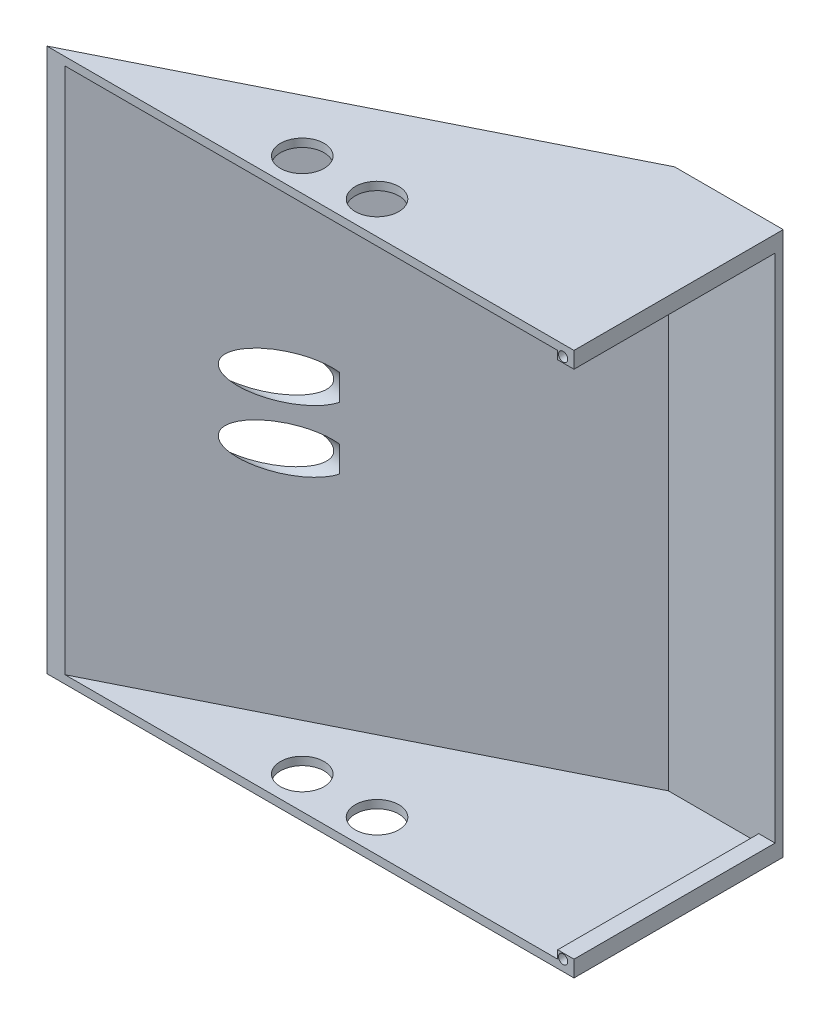
ISO-10303-21;
HEADER;
FILE_DESCRIPTION(('STEP AP214'),'2;1');
FILE_NAME('part.step','',(''),(''),'','','');
FILE_SCHEMA(('AUTOMOTIVE_DESIGN { 1 0 10303 214 1 1 1 1 }'));
ENDSEC;
DATA;
#1=APPLICATION_CONTEXT('core data for automotive mechanical design processes');
#2=APPLICATION_PROTOCOL_DEFINITION('international standard','automotive_design',2000,#1);
#3=PRODUCT_CONTEXT('',#1,'mechanical');
#4=PRODUCT('Part','Part','',(#3));
#5=PRODUCT_RELATED_PRODUCT_CATEGORY('part','',(#4));
#6=PRODUCT_DEFINITION_FORMATION('','',#4);
#7=PRODUCT_DEFINITION_CONTEXT('part definition',#1,'design');
#8=PRODUCT_DEFINITION('design','',#6,#7);
#9=PRODUCT_DEFINITION_SHAPE('','',#8);
#10=(LENGTH_UNIT() NAMED_UNIT(*) SI_UNIT(.MILLI.,.METRE.));
#11=(NAMED_UNIT(*) PLANE_ANGLE_UNIT() SI_UNIT($,.RADIAN.));
#12=(NAMED_UNIT(*) SI_UNIT($,.STERADIAN.) SOLID_ANGLE_UNIT());
#13=UNCERTAINTY_MEASURE_WITH_UNIT(LENGTH_MEASURE(1.E-05),#10,'distance_accuracy_value','');
#14=(GEOMETRIC_REPRESENTATION_CONTEXT(3) GLOBAL_UNCERTAINTY_ASSIGNED_CONTEXT((#13)) GLOBAL_UNIT_ASSIGNED_CONTEXT((#10,
#11,#12)) REPRESENTATION_CONTEXT('',''));
#15=CARTESIAN_POINT('',(0.,0.,0.));
#16=DIRECTION('',(0.,0.,1.));
#17=DIRECTION('',(1.,0.,0.));
#18=AXIS2_PLACEMENT_3D('',#15,#16,#17);
#19=CARTESIAN_POINT('',(0.,0.,-3.));
#20=DIRECTION('',(0.,0.,1.));
#21=DIRECTION('',(1.,0.,0.));
#22=AXIS2_PLACEMENT_3D('',#19,#20,#21);
#23=PLANE('',#22);
#24=DIRECTION('',(1.,0.,0.));
#25=VECTOR('',#24,1.);
#26=CARTESIAN_POINT('',(200.,6.,-3.));
#27=LINE('',#26,#25);
#28=CARTESIAN_POINT('',(194.,6.00000000000001,-3.));
#29=VERTEX_POINT('',#28);
#30=CARTESIAN_POINT('',(200.,6.00000000000001,-3.));
#31=VERTEX_POINT('',#30);
#32=EDGE_CURVE('E202',#29,#31,#27,.T.);
#33=ORIENTED_EDGE('',*,*,#32,.F.);
#34=DIRECTION('',(0.,1.,0.));
#35=VECTOR('',#34,1.);
#36=CARTESIAN_POINT('',(194.,3.,-3.));
#37=LINE('',#36,#35);
#38=CARTESIAN_POINT('',(194.,3.,-3.));
#39=VERTEX_POINT('',#38);
#40=EDGE_CURVE('E204',#39,#29,#37,.T.);
#41=ORIENTED_EDGE('',*,*,#40,.F.);
#42=DIRECTION('',(1.,0.,0.));
#43=VECTOR('',#42,1.);
#44=CARTESIAN_POINT('',(0.,3.,-3.));
#45=LINE('',#44,#43);
#46=CARTESIAN_POINT('',(12.7082039324994,3.,-3.));
#47=VERTEX_POINT('',#46);
#48=EDGE_CURVE('E161',#47,#39,#45,.T.);
#49=ORIENTED_EDGE('',*,*,#48,.F.);
#50=DIRECTION('',(0.,-1.,0.));
#51=VECTOR('',#50,1.);
#52=CARTESIAN_POINT('',(12.7082039324994,200.,-3.));
#53=LINE('',#52,#51);
#54=CARTESIAN_POINT('',(12.7082039324994,197.,-3.));
#55=VERTEX_POINT('',#54);
#56=EDGE_CURVE('E144',#55,#47,#53,.T.);
#57=ORIENTED_EDGE('',*,*,#56,.F.);
#58=DIRECTION('',(1.,0.,0.));
#59=VECTOR('',#58,1.);
#60=CARTESIAN_POINT('',(0.,197.,-3.));
#61=LINE('',#60,#59);
#62=CARTESIAN_POINT('',(194.,197.,-3.));
#63=VERTEX_POINT('',#62);
#64=EDGE_CURVE('E158',#55,#63,#61,.T.);
#65=ORIENTED_EDGE('',*,*,#64,.T.);
#66=DIRECTION('',(0.,-1.,0.));
#67=VECTOR('',#66,1.);
#68=CARTESIAN_POINT('',(194.,197.,-3.));
#69=LINE('',#68,#67);
#70=CARTESIAN_POINT('',(194.,194.,-3.));
#71=VERTEX_POINT('',#70);
#72=EDGE_CURVE('E170',#63,#71,#69,.T.);
#73=ORIENTED_EDGE('',*,*,#72,.T.);
#74=DIRECTION('',(1.,0.,0.));
#75=VECTOR('',#74,1.);
#76=CARTESIAN_POINT('',(200.,194.,-3.));
#77=LINE('',#76,#75);
#78=CARTESIAN_POINT('',(200.,194.,-3.));
#79=VERTEX_POINT('',#78);
#80=EDGE_CURVE('E39',#71,#79,#77,.T.);
#81=ORIENTED_EDGE('',*,*,#80,.T.);
#82=DIRECTION('',(0.,1.,0.));
#83=VECTOR('',#82,1.);
#84=CARTESIAN_POINT('',(200.,200.,-3.));
#85=LINE('',#84,#83);
#86=CARTESIAN_POINT('',(200.,200.,-3.));
#87=VERTEX_POINT('',#86);
#88=EDGE_CURVE('E194',#79,#87,#85,.T.);
#89=ORIENTED_EDGE('',*,*,#88,.T.);
#90=DIRECTION('',(-1.,0.,0.));
#91=VECTOR('',#90,1.);
#92=CARTESIAN_POINT('',(0.,200.,-3.));
#93=LINE('',#92,#91);
#94=CARTESIAN_POINT('',(6.00000000000003,200.,-3.00000000000001));
#95=VERTEX_POINT('',#94);
#96=EDGE_CURVE('E188',#87,#95,#93,.T.);
#97=ORIENTED_EDGE('',*,*,#96,.T.);
#98=DIRECTION('',(0.,-1.,0.));
#99=VECTOR('',#98,1.);
#100=CARTESIAN_POINT('',(6.00000000000001,200.,-3.));
#101=LINE('',#100,#99);
#102=CARTESIAN_POINT('',(6.00000000000003,0.,-3.00000000000001));
#103=VERTEX_POINT('',#102);
#104=EDGE_CURVE('E191',#95,#103,#101,.T.);
#105=ORIENTED_EDGE('',*,*,#104,.T.);
#106=DIRECTION('',(-1.,0.,0.));
#107=VECTOR('',#106,1.);
#108=CARTESIAN_POINT('',(0.,0.,-3.));
#109=LINE('',#108,#107);
#110=CARTESIAN_POINT('',(200.,0.,-3.));
#111=VERTEX_POINT('',#110);
#112=EDGE_CURVE('E198',#111,#103,#109,.T.);
#113=ORIENTED_EDGE('',*,*,#112,.F.);
#114=EDGE_CURVE('E197',#111,#31,#85,.T.);
#115=ORIENTED_EDGE('',*,*,#114,.T.);
#116=EDGE_LOOP('',(#33,#41,#49,#57,#65,#73,#81,#89,#97,#105,#113,#115));
#117=FACE_BOUND('',#116,.T.);
#118=CARTESIAN_POINT('',(196.,196.,-3.));
#119=DIRECTION('',(0.,0.,1.));
#120=DIRECTION('',(1.,0.,0.));
#121=AXIS2_PLACEMENT_3D('',#118,#119,#120);
#122=CIRCLE('',#121,1.69999999999998);
#123=CARTESIAN_POINT('',(197.7,196.,-3.));
#124=VERTEX_POINT('',#123);
#125=EDGE_CURVE('E169',#124,#124,#122,.F.);
#126=ORIENTED_EDGE('',*,*,#125,.T.);
#127=EDGE_LOOP('',(#126));
#128=FACE_BOUND('',#127,.T.);
#129=CARTESIAN_POINT('',(196.,4.,-3.));
#130=DIRECTION('',(0.,0.,1.));
#131=DIRECTION('',(1.,0.,0.));
#132=AXIS2_PLACEMENT_3D('',#129,#130,#131);
#133=CIRCLE('',#132,1.69999999999998);
#134=CARTESIAN_POINT('',(197.7,4.,-3.));
#135=VERTEX_POINT('',#134);
#136=EDGE_CURVE('E173',#135,#135,#133,.F.);
#137=ORIENTED_EDGE('',*,*,#136,.T.);
#138=EDGE_LOOP('',(#137));
#139=FACE_BOUND('',#138,.T.);
#140=ADVANCED_FACE('F35',(#117,#128,#139),#23,.T.);
#141=CARTESIAN_POINT('',(196.,196.,-9.99999999999999));
#142=DIRECTION('',(0.,0.,1.));
#143=DIRECTION('',(1.,0.,0.));
#144=AXIS2_PLACEMENT_3D('',#141,#142,#143);
#145=CONICAL_SURFACE('',#144,1.69999999999998,1.02974425867665);
#146=CARTESIAN_POINT('',(196.,196.,-11.0214630523468));
#147=VERTEX_POINT('',#146);
#148=VERTEX_LOOP('',#147);
#149=FACE_BOUND('',#148,.T.);
#150=CARTESIAN_POINT('',(196.,196.,-9.99999999999999));
#151=DIRECTION('',(0.,0.,1.));
#152=DIRECTION('',(1.,0.,0.));
#153=AXIS2_PLACEMENT_3D('',#150,#151,#152);
#154=CIRCLE('',#153,1.69999999999998);
#155=CARTESIAN_POINT('',(197.7,196.,-9.99999999999999));
#156=VERTEX_POINT('',#155);
#157=EDGE_CURVE('E11',#156,#156,#154,.T.);
#158=ORIENTED_EDGE('',*,*,#157,.T.);
#159=EDGE_LOOP('',(#158));
#160=FACE_BOUND('',#159,.T.);
#161=ADVANCED_FACE('F334',(#149,#160),#145,.F.);
#162=CARTESIAN_POINT('',(196.,196.,0.));
#163=DIRECTION('',(0.,0.,1.));
#164=DIRECTION('',(1.,0.,0.));
#165=AXIS2_PLACEMENT_3D('',#162,#163,#164);
#166=CYLINDRICAL_SURFACE('',#165,1.69999999999998);
#167=ORIENTED_EDGE('',*,*,#157,.F.);
#168=EDGE_LOOP('',(#167));
#169=FACE_BOUND('',#168,.T.);
#170=ORIENTED_EDGE('',*,*,#125,.F.);
#171=EDGE_LOOP('',(#170));
#172=FACE_BOUND('',#171,.T.);
#173=ADVANCED_FACE('F336',(#169,#172),#166,.F.);
#174=CARTESIAN_POINT('',(196.,4.,-9.99999999999999));
#175=DIRECTION('',(0.,0.,1.));
#176=DIRECTION('',(1.,0.,0.));
#177=AXIS2_PLACEMENT_3D('',#174,#175,#176);
#178=CONICAL_SURFACE('',#177,1.69999999999998,1.02974425867665);
#179=CARTESIAN_POINT('',(196.,4.,-11.0214630523468));
#180=VERTEX_POINT('',#179);
#181=VERTEX_LOOP('',#180);
#182=FACE_BOUND('',#181,.T.);
#183=CARTESIAN_POINT('',(196.,4.,-9.99999999999999));
#184=DIRECTION('',(0.,0.,1.));
#185=DIRECTION('',(1.,0.,0.));
#186=AXIS2_PLACEMENT_3D('',#183,#184,#185);
#187=CIRCLE('',#186,1.69999999999998);
#188=CARTESIAN_POINT('',(197.7,4.,-9.99999999999999));
#189=VERTEX_POINT('',#188);
#190=EDGE_CURVE('E44',#189,#189,#187,.T.);
#191=ORIENTED_EDGE('',*,*,#190,.T.);
#192=EDGE_LOOP('',(#191));
#193=FACE_BOUND('',#192,.T.);
#194=ADVANCED_FACE('F342',(#182,#193),#178,.F.);
#195=CARTESIAN_POINT('',(196.,4.,0.));
#196=DIRECTION('',(0.,0.,1.));
#197=DIRECTION('',(1.,0.,0.));
#198=AXIS2_PLACEMENT_3D('',#195,#196,#197);
#199=CYLINDRICAL_SURFACE('',#198,1.69999999999998);
#200=ORIENTED_EDGE('',*,*,#190,.F.);
#201=EDGE_LOOP('',(#200));
#202=FACE_BOUND('',#201,.T.);
#203=ORIENTED_EDGE('',*,*,#136,.F.);
#204=EDGE_LOOP('',(#203));
#205=FACE_BOUND('',#204,.T.);
#206=ADVANCED_FACE('F37',(#202,#205),#199,.F.);
#207=CARTESIAN_POINT('',(200.,200.,0.));
#208=DIRECTION('',(-1.,0.,0.));
#209=DIRECTION('',(0.,0.,1.));
#210=AXIS2_PLACEMENT_3D('',#207,#208,#209);
#211=PLANE('',#210);
#212=ORIENTED_EDGE('',*,*,#114,.F.);
#213=DIRECTION('',(0.,0.,-1.));
#214=VECTOR('',#213,1.);
#215=CARTESIAN_POINT('',(200.,0.,0.));
#216=LINE('',#215,#214);
#217=CARTESIAN_POINT('',(200.,0.,-80.));
#218=VERTEX_POINT('',#217);
#219=EDGE_CURVE('E178',#111,#218,#216,.T.);
#220=ORIENTED_EDGE('',*,*,#219,.T.);
#221=DIRECTION('',(0.,-1.,0.));
#222=VECTOR('',#221,1.);
#223=CARTESIAN_POINT('',(200.,200.,-80.));
#224=LINE('',#223,#222);
#225=CARTESIAN_POINT('',(200.,200.,-80.));
#226=VERTEX_POINT('',#225);
#227=EDGE_CURVE('E272',#226,#218,#224,.T.);
#228=ORIENTED_EDGE('',*,*,#227,.F.);
#229=DIRECTION('',(0.,0.,-1.));
#230=VECTOR('',#229,1.);
#231=CARTESIAN_POINT('',(200.,200.,0.));
#232=LINE('',#231,#230);
#233=EDGE_CURVE('E183',#87,#226,#232,.T.);
#234=ORIENTED_EDGE('',*,*,#233,.F.);
#235=ORIENTED_EDGE('',*,*,#88,.F.);
#236=DIRECTION('',(0.,0.,1.));
#237=VECTOR('',#236,1.);
#238=CARTESIAN_POINT('',(200.,194.,-78.));
#239=LINE('',#238,#237);
#240=CARTESIAN_POINT('',(200.,194.,-77.));
#241=VERTEX_POINT('',#240);
#242=EDGE_CURVE('E212',#241,#79,#239,.T.);
#243=ORIENTED_EDGE('',*,*,#242,.F.);
#244=DIRECTION('',(0.,-1.,0.));
#245=VECTOR('',#244,1.);
#246=CARTESIAN_POINT('',(200.,200.,-77.));
#247=LINE('',#246,#245);
#248=CARTESIAN_POINT('',(200.,6.00000000000001,-77.));
#249=VERTEX_POINT('',#248);
#250=EDGE_CURVE('E162',#241,#249,#247,.T.);
#251=ORIENTED_EDGE('',*,*,#250,.T.);
#252=DIRECTION('',(0.,0.,1.));
#253=VECTOR('',#252,1.);
#254=CARTESIAN_POINT('',(200.,6.,-78.));
#255=LINE('',#254,#253);
#256=EDGE_CURVE('E205',#249,#31,#255,.T.);
#257=ORIENTED_EDGE('',*,*,#256,.T.);
#258=EDGE_LOOP('',(#212,#220,#228,#234,#235,#243,#251,#257));
#259=FACE_BOUND('',#258,.T.);
#260=ADVANCED_FACE('F303',(#259),#211,.F.);
#261=CARTESIAN_POINT('',(160.,200.,-80.));
#262=DIRECTION('',(0.447213595499958,0.,0.894427190999916));
#263=DIRECTION('',(0.894427190999916,0.,-0.447213595499958));
#264=AXIS2_PLACEMENT_3D('',#261,#262,#263);
#265=PLANE('',#264);
#266=CARTESIAN_POINT('',(60.,88.575,-30.));
#267=DIRECTION('',(0.447213595499958,0.,0.894427190999916));
#268=DIRECTION('',(-0.894427190999916,0.,0.447213595499958));
#269=AXIS2_PLACEMENT_3D('',#266,#267,#268);
#270=ELLIPSE('',#269,18.3357574154983,8.2);
#271=CARTESIAN_POINT('',(43.6,88.575,-21.8));
#272=VERTEX_POINT('',#271);
#273=EDGE_CURVE('E254',#272,#272,#270,.F.);
#274=ORIENTED_EDGE('',*,*,#273,.F.);
#275=EDGE_LOOP('',(#274));
#276=FACE_BOUND('',#275,.T.);
#277=CARTESIAN_POINT('',(60.,111.425,-30.));
#278=DIRECTION('',(0.447213595499958,0.,0.894427190999916));
#279=DIRECTION('',(-0.894427190999916,0.,0.447213595499958));
#280=AXIS2_PLACEMENT_3D('',#277,#278,#279);
#281=ELLIPSE('',#280,18.3357574154983,8.2);
#282=CARTESIAN_POINT('',(43.6,111.425,-21.8));
#283=VERTEX_POINT('',#282);
#284=EDGE_CURVE('E259',#283,#283,#281,.F.);
#285=ORIENTED_EDGE('',*,*,#284,.F.);
#286=EDGE_LOOP('',(#285));
#287=FACE_BOUND('',#286,.T.);
#288=ORIENTED_EDGE('',*,*,#104,.F.);
#289=DIRECTION('',(-0.894427190999916,0.,0.447213595499958));
#290=VECTOR('',#289,1.);
#291=CARTESIAN_POINT('',(160.,200.,-80.));
#292=LINE('',#291,#290);
#293=CARTESIAN_POINT('',(160.,200.,-80.));
#294=VERTEX_POINT('',#293);
#295=EDGE_CURVE('E181',#294,#95,#292,.T.);
#296=ORIENTED_EDGE('',*,*,#295,.F.);
#297=DIRECTION('',(0.,-1.,0.));
#298=VECTOR('',#297,1.);
#299=CARTESIAN_POINT('',(160.,200.,-80.));
#300=LINE('',#299,#298);
#301=CARTESIAN_POINT('',(160.,0.,-80.));
#302=VERTEX_POINT('',#301);
#303=EDGE_CURVE('E268',#294,#302,#300,.T.);
#304=ORIENTED_EDGE('',*,*,#303,.T.);
#305=DIRECTION('',(-0.894427190999916,0.,0.447213595499958));
#306=VECTOR('',#305,1.);
#307=CARTESIAN_POINT('',(160.,0.,-80.));
#308=LINE('',#307,#306);
#309=EDGE_CURVE('E163',#302,#103,#308,.T.);
#310=ORIENTED_EDGE('',*,*,#309,.T.);
#311=EDGE_LOOP('',(#288,#296,#304,#310));
#312=FACE_BOUND('',#311,.T.);
#313=ADVANCED_FACE('F313',(#276,#287,#312),#265,.F.);
#314=CARTESIAN_POINT('',(0.,200.,0.));
#315=DIRECTION('',(0.,-1.,0.));
#316=DIRECTION('',(0.,0.,-1.));
#317=AXIS2_PLACEMENT_3D('',#314,#315,#316);
#318=PLANE('',#317);
#319=CARTESIAN_POINT('',(115.531571483976,200.,-15.));
#320=DIRECTION('',(0.,1.,0.));
#321=DIRECTION('',(0.,0.,1.));
#322=AXIS2_PLACEMENT_3D('',#319,#320,#321);
#323=CIRCLE('',#322,8.02);
#324=CARTESIAN_POINT('',(115.531571483976,200.,-6.98));
#325=VERTEX_POINT('',#324);
#326=EDGE_CURVE('E246',#325,#325,#323,.T.);
#327=ORIENTED_EDGE('',*,*,#326,.F.);
#328=EDGE_LOOP('',(#327));
#329=FACE_BOUND('',#328,.T.);
#330=CARTESIAN_POINT('',(88.0115714839764,200.,-15.));
#331=DIRECTION('',(0.,1.,0.));
#332=DIRECTION('',(0.,0.,1.));
#333=AXIS2_PLACEMENT_3D('',#330,#331,#332);
#334=CIRCLE('',#333,8.02);
#335=CARTESIAN_POINT('',(88.0115714839764,200.,-6.98));
#336=VERTEX_POINT('',#335);
#337=EDGE_CURVE('E242',#336,#336,#334,.T.);
#338=ORIENTED_EDGE('',*,*,#337,.F.);
#339=EDGE_LOOP('',(#338));
#340=FACE_BOUND('',#339,.T.);
#341=ORIENTED_EDGE('',*,*,#96,.F.);
#342=ORIENTED_EDGE('',*,*,#233,.T.);
#343=DIRECTION('',(-1.,0.,0.));
#344=VECTOR('',#343,1.);
#345=CARTESIAN_POINT('',(200.,200.,-80.));
#346=LINE('',#345,#344);
#347=EDGE_CURVE('E184',#226,#294,#346,.T.);
#348=ORIENTED_EDGE('',*,*,#347,.T.);
#349=ORIENTED_EDGE('',*,*,#295,.T.);
#350=EDGE_LOOP('',(#341,#342,#348,#349));
#351=FACE_BOUND('',#350,.T.);
#352=ADVANCED_FACE('F307',(#329,#340,#351),#318,.F.);
#353=CARTESIAN_POINT('',(0.,0.,0.));
#354=DIRECTION('',(0.,-1.,0.));
#355=DIRECTION('',(0.,0.,-1.));
#356=AXIS2_PLACEMENT_3D('',#353,#354,#355);
#357=PLANE('',#356);
#358=CARTESIAN_POINT('',(88.0115714839764,0.,-15.));
#359=DIRECTION('',(0.,-1.,0.));
#360=DIRECTION('',(0.,0.,-1.));
#361=AXIS2_PLACEMENT_3D('',#358,#359,#360);
#362=CIRCLE('',#361,8.02000000000001);
#363=CARTESIAN_POINT('',(88.0115714839764,0.,-23.02));
#364=VERTEX_POINT('',#363);
#365=EDGE_CURVE('E230',#364,#364,#362,.T.);
#366=ORIENTED_EDGE('',*,*,#365,.F.);
#367=EDGE_LOOP('',(#366));
#368=FACE_BOUND('',#367,.T.);
#369=CARTESIAN_POINT('',(115.531571483976,0.,-15.));
#370=DIRECTION('',(0.,-1.,0.));
#371=DIRECTION('',(0.,0.,-1.));
#372=AXIS2_PLACEMENT_3D('',#369,#370,#371);
#373=CIRCLE('',#372,8.02000000000001);
#374=CARTESIAN_POINT('',(115.531571483976,0.,-23.02));
#375=VERTEX_POINT('',#374);
#376=EDGE_CURVE('E234',#375,#375,#373,.T.);
#377=ORIENTED_EDGE('',*,*,#376,.F.);
#378=EDGE_LOOP('',(#377));
#379=FACE_BOUND('',#378,.T.);
#380=ORIENTED_EDGE('',*,*,#219,.F.);
#381=ORIENTED_EDGE('',*,*,#112,.T.);
#382=ORIENTED_EDGE('',*,*,#309,.F.);
#383=DIRECTION('',(-1.,0.,0.));
#384=VECTOR('',#383,1.);
#385=CARTESIAN_POINT('',(200.,0.,-80.));
#386=LINE('',#385,#384);
#387=EDGE_CURVE('E180',#218,#302,#386,.T.);
#388=ORIENTED_EDGE('',*,*,#387,.F.);
#389=EDGE_LOOP('',(#380,#381,#382,#388));
#390=FACE_BOUND('',#389,.T.);
#391=ADVANCED_FACE('F320',(#368,#379,#390),#357,.T.);
#392=CARTESIAN_POINT('',(200.,200.,-77.));
#393=DIRECTION('',(0.,0.,1.));
#394=DIRECTION('',(1.,0.,0.));
#395=AXIS2_PLACEMENT_3D('',#392,#393,#394);
#396=PLANE('',#395);
#397=DIRECTION('',(1.,0.,0.));
#398=VECTOR('',#397,1.);
#399=CARTESIAN_POINT('',(200.,194.,-77.));
#400=LINE('',#399,#398);
#401=CARTESIAN_POINT('',(194.,194.,-77.));
#402=VERTEX_POINT('',#401);
#403=EDGE_CURVE('E206',#402,#241,#400,.T.);
#404=ORIENTED_EDGE('',*,*,#403,.F.);
#405=DIRECTION('',(0.,-1.,0.));
#406=VECTOR('',#405,1.);
#407=CARTESIAN_POINT('',(194.,200.,-77.));
#408=LINE('',#407,#406);
#409=CARTESIAN_POINT('',(194.,197.,-77.));
#410=VERTEX_POINT('',#409);
#411=EDGE_CURVE('E214',#410,#402,#408,.T.);
#412=ORIENTED_EDGE('',*,*,#411,.F.);
#413=DIRECTION('',(-1.,0.,0.));
#414=VECTOR('',#413,1.);
#415=CARTESIAN_POINT('',(0.,197.,-77.));
#416=LINE('',#415,#414);
#417=CARTESIAN_POINT('',(160.708203932499,197.,-77.));
#418=VERTEX_POINT('',#417);
#419=EDGE_CURVE('E151',#410,#418,#416,.T.);
#420=ORIENTED_EDGE('',*,*,#419,.T.);
#421=DIRECTION('',(0.,-1.,0.));
#422=VECTOR('',#421,1.);
#423=CARTESIAN_POINT('',(160.708203932499,200.,-77.));
#424=LINE('',#423,#422);
#425=CARTESIAN_POINT('',(160.708203932499,3.,-77.));
#426=VERTEX_POINT('',#425);
#427=EDGE_CURVE('E147',#418,#426,#424,.T.);
#428=ORIENTED_EDGE('',*,*,#427,.T.);
#429=DIRECTION('',(-1.,0.,0.));
#430=VECTOR('',#429,1.);
#431=CARTESIAN_POINT('',(0.,3.,-77.));
#432=LINE('',#431,#430);
#433=CARTESIAN_POINT('',(194.,3.,-77.));
#434=VERTEX_POINT('',#433);
#435=EDGE_CURVE('E150',#434,#426,#432,.T.);
#436=ORIENTED_EDGE('',*,*,#435,.F.);
#437=DIRECTION('',(0.,1.,0.));
#438=VECTOR('',#437,1.);
#439=CARTESIAN_POINT('',(194.,200.,-77.));
#440=LINE('',#439,#438);
#441=CARTESIAN_POINT('',(194.,6.00000000000001,-77.));
#442=VERTEX_POINT('',#441);
#443=EDGE_CURVE('E224',#434,#442,#440,.T.);
#444=ORIENTED_EDGE('',*,*,#443,.T.);
#445=DIRECTION('',(1.,0.,0.));
#446=VECTOR('',#445,1.);
#447=CARTESIAN_POINT('',(200.,6.00000000000001,-77.));
#448=LINE('',#447,#446);
#449=EDGE_CURVE('E288',#442,#249,#448,.T.);
#450=ORIENTED_EDGE('',*,*,#449,.T.);
#451=ORIENTED_EDGE('',*,*,#250,.F.);
#452=EDGE_LOOP('',(#404,#412,#420,#428,#436,#444,#450,#451));
#453=FACE_BOUND('',#452,.T.);
#454=ADVANCED_FACE('F356',(#453),#396,.T.);
#455=CARTESIAN_POINT('',(0.,3.,0.));
#456=DIRECTION('',(0.,-1.,0.));
#457=DIRECTION('',(0.,0.,-1.));
#458=AXIS2_PLACEMENT_3D('',#455,#456,#457);
#459=PLANE('',#458);
#460=CARTESIAN_POINT('',(115.531571483976,3.,-15.));
#461=DIRECTION('',(0.,-1.,0.));
#462=DIRECTION('',(0.,0.,-1.));
#463=AXIS2_PLACEMENT_3D('',#460,#461,#462);
#464=CIRCLE('',#463,8.02000000000001);
#465=CARTESIAN_POINT('',(115.531571483976,3.,-23.02));
#466=VERTEX_POINT('',#465);
#467=EDGE_CURVE('E226',#466,#466,#464,.T.);
#468=ORIENTED_EDGE('',*,*,#467,.T.);
#469=EDGE_LOOP('',(#468));
#470=FACE_BOUND('',#469,.T.);
#471=CARTESIAN_POINT('',(88.0115714839764,3.,-15.));
#472=DIRECTION('',(0.,-1.,0.));
#473=DIRECTION('',(0.,0.,-1.));
#474=AXIS2_PLACEMENT_3D('',#471,#472,#473);
#475=CIRCLE('',#474,8.02000000000001);
#476=CARTESIAN_POINT('',(88.0115714839764,3.,-23.02));
#477=VERTEX_POINT('',#476);
#478=EDGE_CURVE('E227',#477,#477,#475,.T.);
#479=ORIENTED_EDGE('',*,*,#478,.T.);
#480=EDGE_LOOP('',(#479));
#481=FACE_BOUND('',#480,.T.);
#482=DIRECTION('',(0.,0.,1.));
#483=VECTOR('',#482,1.);
#484=CARTESIAN_POINT('',(194.,3.,0.));
#485=LINE('',#484,#483);
#486=EDGE_CURVE('E285',#434,#39,#485,.T.);
#487=ORIENTED_EDGE('',*,*,#486,.F.);
#488=ORIENTED_EDGE('',*,*,#435,.T.);
#489=DIRECTION('',(-0.894427190999916,0.,0.447213595499958));
#490=VECTOR('',#489,1.);
#491=CARTESIAN_POINT('',(1.34164078649987,3.,2.68328157299975));
#492=LINE('',#491,#490);
#493=EDGE_CURVE('E201',#426,#47,#492,.T.);
#494=ORIENTED_EDGE('',*,*,#493,.T.);
#495=ORIENTED_EDGE('',*,*,#48,.T.);
#496=EDGE_LOOP('',(#487,#488,#494,#495));
#497=FACE_BOUND('',#496,.T.);
#498=ADVANCED_FACE('F331',(#470,#481,#497),#459,.F.);
#499=CARTESIAN_POINT('',(161.3416407865,200.,-77.3167184270003));
#500=DIRECTION('',(0.447213595499958,0.,0.894427190999916));
#501=DIRECTION('',(0.894427190999916,0.,-0.447213595499958));
#502=AXIS2_PLACEMENT_3D('',#499,#500,#501);
#503=PLANE('',#502);
#504=ORIENTED_EDGE('',*,*,#493,.F.);
#505=ORIENTED_EDGE('',*,*,#427,.F.);
#506=DIRECTION('',(-0.894427190999916,0.,0.447213595499958));
#507=VECTOR('',#506,1.);
#508=CARTESIAN_POINT('',(1.34164078649987,197.,2.68328157299975));
#509=LINE('',#508,#507);
#510=EDGE_CURVE('E139',#418,#55,#509,.T.);
#511=ORIENTED_EDGE('',*,*,#510,.T.);
#512=ORIENTED_EDGE('',*,*,#56,.T.);
#513=EDGE_LOOP('',(#504,#505,#511,#512));
#514=FACE_BOUND('',#513,.T.);
#515=DIRECTION('',(0.,1.,0.));
#516=VECTOR('',#515,1.);
#517=CARTESIAN_POINT('',(80.,200.,-36.6458980337503));
#518=LINE('',#517,#516);
#519=CARTESIAN_POINT('',(80.,83.771663729761,-36.6458980337503));
#520=VERTEX_POINT('',#519);
#521=CARTESIAN_POINT('',(80.,93.378336270239,-36.6458980337503));
#522=VERTEX_POINT('',#521);
#523=EDGE_CURVE('E275',#520,#522,#518,.T.);
#524=ORIENTED_EDGE('',*,*,#523,.F.);
#525=CARTESIAN_POINT('',(66.7082039324994,88.575,-30.));
#526=DIRECTION('',(0.447213595499958,0.,0.894427190999916));
#527=DIRECTION('',(-0.894427190999916,0.,0.447213595499958));
#528=AXIS2_PLACEMENT_3D('',#525,#526,#527);
#529=ELLIPSE('',#528,18.3357574154983,8.2);
#530=EDGE_CURVE('E277',#520,#522,#529,.F.);
#531=ORIENTED_EDGE('',*,*,#530,.T.);
#532=EDGE_LOOP('',(#524,#531));
#533=FACE_BOUND('',#532,.T.);
#534=DIRECTION('',(0.,1.,0.));
#535=VECTOR('',#534,1.);
#536=CARTESIAN_POINT('',(80.,200.,-36.6458980337503));
#537=LINE('',#536,#535);
#538=CARTESIAN_POINT('',(80.,106.621663729761,-36.6458980337503));
#539=VERTEX_POINT('',#538);
#540=CARTESIAN_POINT('',(80.,116.228336270239,-36.6458980337503));
#541=VERTEX_POINT('',#540);
#542=EDGE_CURVE('E280',#539,#541,#537,.T.);
#543=ORIENTED_EDGE('',*,*,#542,.F.);
#544=CARTESIAN_POINT('',(66.7082039324994,111.425,-30.));
#545=DIRECTION('',(0.447213595499958,0.,0.894427190999916));
#546=DIRECTION('',(-0.894427190999916,0.,0.447213595499958));
#547=AXIS2_PLACEMENT_3D('',#544,#545,#546);
#548=ELLIPSE('',#547,18.3357574154983,8.2);
#549=EDGE_CURVE('E282',#539,#541,#548,.F.);
#550=ORIENTED_EDGE('',*,*,#549,.T.);
#551=EDGE_LOOP('',(#543,#550));
#552=FACE_BOUND('',#551,.T.);
#553=ADVANCED_FACE('F142',(#514,#533,#552),#503,.T.);
#554=CARTESIAN_POINT('',(200.,200.,-80.));
#555=DIRECTION('',(0.,0.,1.));
#556=DIRECTION('',(1.,0.,0.));
#557=AXIS2_PLACEMENT_3D('',#554,#555,#556);
#558=PLANE('',#557);
#559=ORIENTED_EDGE('',*,*,#387,.T.);
#560=ORIENTED_EDGE('',*,*,#303,.F.);
#561=ORIENTED_EDGE('',*,*,#347,.F.);
#562=ORIENTED_EDGE('',*,*,#227,.T.);
#563=EDGE_LOOP('',(#559,#560,#561,#562));
#564=FACE_BOUND('',#563,.T.);
#565=ADVANCED_FACE('F322',(#564),#558,.F.);
#566=CARTESIAN_POINT('',(0.,197.,0.));
#567=DIRECTION('',(0.,-1.,0.));
#568=DIRECTION('',(0.,0.,-1.));
#569=AXIS2_PLACEMENT_3D('',#566,#567,#568);
#570=PLANE('',#569);
#571=DIRECTION('',(0.,0.,-1.));
#572=VECTOR('',#571,1.);
#573=CARTESIAN_POINT('',(194.,197.,0.));
#574=LINE('',#573,#572);
#575=EDGE_CURVE('E168',#63,#410,#574,.T.);
#576=ORIENTED_EDGE('',*,*,#575,.F.);
#577=ORIENTED_EDGE('',*,*,#64,.F.);
#578=ORIENTED_EDGE('',*,*,#510,.F.);
#579=ORIENTED_EDGE('',*,*,#419,.F.);
#580=EDGE_LOOP('',(#576,#577,#578,#579));
#581=FACE_BOUND('',#580,.T.);
#582=CARTESIAN_POINT('',(88.0115714839764,197.,-15.));
#583=DIRECTION('',(0.,1.,0.));
#584=DIRECTION('',(0.,0.,1.));
#585=AXIS2_PLACEMENT_3D('',#582,#583,#584);
#586=CIRCLE('',#585,8.02);
#587=CARTESIAN_POINT('',(88.0115714839764,197.,-6.98));
#588=VERTEX_POINT('',#587);
#589=EDGE_CURVE('E239',#588,#588,#586,.T.);
#590=ORIENTED_EDGE('',*,*,#589,.T.);
#591=EDGE_LOOP('',(#590));
#592=FACE_BOUND('',#591,.T.);
#593=CARTESIAN_POINT('',(115.531571483976,197.,-15.));
#594=DIRECTION('',(0.,1.,0.));
#595=DIRECTION('',(0.,0.,1.));
#596=AXIS2_PLACEMENT_3D('',#593,#594,#595);
#597=CIRCLE('',#596,8.02);
#598=CARTESIAN_POINT('',(115.531571483976,197.,-6.98));
#599=VERTEX_POINT('',#598);
#600=EDGE_CURVE('E231',#599,#599,#597,.T.);
#601=ORIENTED_EDGE('',*,*,#600,.T.);
#602=EDGE_LOOP('',(#601));
#603=FACE_BOUND('',#602,.T.);
#604=ADVANCED_FACE('F165',(#581,#592,#603),#570,.T.);
#605=CARTESIAN_POINT('',(80.,88.575,-30.));
#606=DIRECTION('',(-1.,0.,0.));
#607=DIRECTION('',(0.,0.,1.));
#608=AXIS2_PLACEMENT_3D('',#605,#606,#607);
#609=CYLINDRICAL_SURFACE('',#608,8.2);
#610=CARTESIAN_POINT('',(80.,88.575,-30.));
#611=DIRECTION('',(1.,0.,0.));
#612=DIRECTION('',(0.,0.,-1.));
#613=AXIS2_PLACEMENT_3D('',#610,#611,#612);
#614=CIRCLE('',#613,8.2);
#615=EDGE_CURVE('E243',#520,#522,#614,.T.);
#616=ORIENTED_EDGE('',*,*,#615,.T.);
#617=ORIENTED_EDGE('',*,*,#530,.F.);
#618=EDGE_LOOP('',(#616,#617));
#619=FACE_BOUND('',#618,.T.);
#620=ORIENTED_EDGE('',*,*,#273,.T.);
#621=EDGE_LOOP('',(#620));
#622=FACE_BOUND('',#621,.T.);
#623=ADVANCED_FACE('F329',(#619,#622),#609,.F.);
#624=CARTESIAN_POINT('',(80.,88.575,-30.));
#625=DIRECTION('',(1.,0.,0.));
#626=DIRECTION('',(0.,0.,-1.));
#627=AXIS2_PLACEMENT_3D('',#624,#625,#626);
#628=PLANE('',#627);
#629=ORIENTED_EDGE('',*,*,#523,.T.);
#630=ORIENTED_EDGE('',*,*,#615,.F.);
#631=EDGE_LOOP('',(#629,#630));
#632=FACE_BOUND('',#631,.T.);
#633=ADVANCED_FACE('F448',(#632),#628,.F.);
#634=CARTESIAN_POINT('',(80.,111.425,-30.));
#635=DIRECTION('',(-1.,0.,0.));
#636=DIRECTION('',(0.,0.,1.));
#637=AXIS2_PLACEMENT_3D('',#634,#635,#636);
#638=CYLINDRICAL_SURFACE('',#637,8.2);
#639=CARTESIAN_POINT('',(80.,111.425,-30.));
#640=DIRECTION('',(1.,0.,0.));
#641=DIRECTION('',(0.,0.,-1.));
#642=AXIS2_PLACEMENT_3D('',#639,#640,#641);
#643=CIRCLE('',#642,8.2);
#644=EDGE_CURVE('E251',#539,#541,#643,.T.);
#645=ORIENTED_EDGE('',*,*,#644,.T.);
#646=ORIENTED_EDGE('',*,*,#549,.F.);
#647=EDGE_LOOP('',(#645,#646));
#648=FACE_BOUND('',#647,.T.);
#649=ORIENTED_EDGE('',*,*,#284,.T.);
#650=EDGE_LOOP('',(#649));
#651=FACE_BOUND('',#650,.T.);
#652=ADVANCED_FACE('F439',(#648,#651),#638,.F.);
#653=CARTESIAN_POINT('',(80.,111.425,-30.));
#654=DIRECTION('',(1.,0.,0.));
#655=DIRECTION('',(0.,0.,-1.));
#656=AXIS2_PLACEMENT_3D('',#653,#654,#655);
#657=PLANE('',#656);
#658=ORIENTED_EDGE('',*,*,#542,.T.);
#659=ORIENTED_EDGE('',*,*,#644,.F.);
#660=EDGE_LOOP('',(#658,#659));
#661=FACE_BOUND('',#660,.T.);
#662=ADVANCED_FACE('F379',(#661),#657,.F.);
#663=CARTESIAN_POINT('',(115.531571483976,197.,-15.));
#664=DIRECTION('',(0.,1.,0.));
#665=DIRECTION('',(0.,0.,1.));
#666=AXIS2_PLACEMENT_3D('',#663,#664,#665);
#667=CYLINDRICAL_SURFACE('',#666,8.02);
#668=ORIENTED_EDGE('',*,*,#600,.F.);
#669=EDGE_LOOP('',(#668));
#670=FACE_BOUND('',#669,.T.);
#671=ORIENTED_EDGE('',*,*,#326,.T.);
#672=EDGE_LOOP('',(#671));
#673=FACE_BOUND('',#672,.T.);
#674=ADVANCED_FACE('F369',(#670,#673),#667,.F.);
#675=CARTESIAN_POINT('',(88.0115714839764,197.,-15.));
#676=DIRECTION('',(0.,1.,0.));
#677=DIRECTION('',(0.,0.,1.));
#678=AXIS2_PLACEMENT_3D('',#675,#676,#677);
#679=CYLINDRICAL_SURFACE('',#678,8.02);
#680=ORIENTED_EDGE('',*,*,#589,.F.);
#681=EDGE_LOOP('',(#680));
#682=FACE_BOUND('',#681,.T.);
#683=ORIENTED_EDGE('',*,*,#337,.T.);
#684=EDGE_LOOP('',(#683));
#685=FACE_BOUND('',#684,.T.);
#686=ADVANCED_FACE('F366',(#682,#685),#679,.F.);
#687=CARTESIAN_POINT('',(115.531571483976,3.,-15.));
#688=DIRECTION('',(0.,-1.,0.));
#689=DIRECTION('',(0.,0.,-1.));
#690=AXIS2_PLACEMENT_3D('',#687,#688,#689);
#691=CYLINDRICAL_SURFACE('',#690,8.02000000000001);
#692=ORIENTED_EDGE('',*,*,#467,.F.);
#693=EDGE_LOOP('',(#692));
#694=FACE_BOUND('',#693,.T.);
#695=ORIENTED_EDGE('',*,*,#376,.T.);
#696=EDGE_LOOP('',(#695));
#697=FACE_BOUND('',#696,.T.);
#698=ADVANCED_FACE('F368',(#694,#697),#691,.F.);
#699=CARTESIAN_POINT('',(88.0115714839764,3.,-15.));
#700=DIRECTION('',(0.,-1.,0.));
#701=DIRECTION('',(0.,0.,-1.));
#702=AXIS2_PLACEMENT_3D('',#699,#700,#701);
#703=CYLINDRICAL_SURFACE('',#702,8.02000000000001);
#704=ORIENTED_EDGE('',*,*,#478,.F.);
#705=EDGE_LOOP('',(#704));
#706=FACE_BOUND('',#705,.T.);
#707=ORIENTED_EDGE('',*,*,#365,.T.);
#708=EDGE_LOOP('',(#707));
#709=FACE_BOUND('',#708,.T.);
#710=ADVANCED_FACE('F376',(#706,#709),#703,.F.);
#711=CARTESIAN_POINT('',(194.,3.,-78.));
#712=DIRECTION('',(1.,0.,0.));
#713=DIRECTION('',(0.,0.,-1.));
#714=AXIS2_PLACEMENT_3D('',#711,#712,#713);
#715=PLANE('',#714);
#716=ORIENTED_EDGE('',*,*,#443,.F.);
#717=ORIENTED_EDGE('',*,*,#486,.T.);
#718=ORIENTED_EDGE('',*,*,#40,.T.);
#719=DIRECTION('',(0.,0.,1.));
#720=VECTOR('',#719,1.);
#721=CARTESIAN_POINT('',(194.,6.,-78.));
#722=LINE('',#721,#720);
#723=EDGE_CURVE('E221',#442,#29,#722,.T.);
#724=ORIENTED_EDGE('',*,*,#723,.F.);
#725=EDGE_LOOP('',(#716,#717,#718,#724));
#726=FACE_BOUND('',#725,.T.);
#727=ADVANCED_FACE('F387',(#726),#715,.F.);
#728=CARTESIAN_POINT('',(200.,6.,-78.));
#729=DIRECTION('',(0.,-1.,0.));
#730=DIRECTION('',(0.,0.,-1.));
#731=AXIS2_PLACEMENT_3D('',#728,#729,#730);
#732=PLANE('',#731);
#733=ORIENTED_EDGE('',*,*,#449,.F.);
#734=ORIENTED_EDGE('',*,*,#723,.T.);
#735=ORIENTED_EDGE('',*,*,#32,.T.);
#736=ORIENTED_EDGE('',*,*,#256,.F.);
#737=EDGE_LOOP('',(#733,#734,#735,#736));
#738=FACE_BOUND('',#737,.T.);
#739=ADVANCED_FACE('F391',(#738),#732,.F.);
#740=CARTESIAN_POINT('',(200.,194.,-78.));
#741=DIRECTION('',(0.,-1.,0.));
#742=DIRECTION('',(0.,0.,-1.));
#743=AXIS2_PLACEMENT_3D('',#740,#741,#742);
#744=PLANE('',#743);
#745=DIRECTION('',(0.,0.,1.));
#746=VECTOR('',#745,1.);
#747=CARTESIAN_POINT('',(194.,194.,-78.));
#748=LINE('',#747,#746);
#749=EDGE_CURVE('E210',#402,#71,#748,.T.);
#750=ORIENTED_EDGE('',*,*,#749,.F.);
#751=ORIENTED_EDGE('',*,*,#403,.T.);
#752=ORIENTED_EDGE('',*,*,#242,.T.);
#753=ORIENTED_EDGE('',*,*,#80,.F.);
#754=EDGE_LOOP('',(#750,#751,#752,#753));
#755=FACE_BOUND('',#754,.T.);
#756=ADVANCED_FACE('F298',(#755),#744,.T.);
#757=CARTESIAN_POINT('',(194.,197.,-78.));
#758=DIRECTION('',(-1.,0.,0.));
#759=DIRECTION('',(0.,0.,1.));
#760=AXIS2_PLACEMENT_3D('',#757,#758,#759);
#761=PLANE('',#760);
#762=ORIENTED_EDGE('',*,*,#575,.T.);
#763=ORIENTED_EDGE('',*,*,#411,.T.);
#764=ORIENTED_EDGE('',*,*,#749,.T.);
#765=ORIENTED_EDGE('',*,*,#72,.F.);
#766=EDGE_LOOP('',(#762,#763,#764,#765));
#767=FACE_BOUND('',#766,.T.);
#768=ADVANCED_FACE('F292',(#767),#761,.T.);
#769=CLOSED_SHELL('',(#140,#161,#173,#194,#206,#260,#313,#352,#391,#454,#498,#553,#565,#604,
#623,#633,#652,#662,#674,#686,#698,#710,#727,#739,#756,#768));
#770=MANIFOLD_SOLID_BREP('B2',#769);
#771=ADVANCED_BREP_SHAPE_REPRESENTATION('',(#18,#770),#14);
#772=SHAPE_DEFINITION_REPRESENTATION(#9,#771);
ENDSEC;
END-ISO-10303-21;
